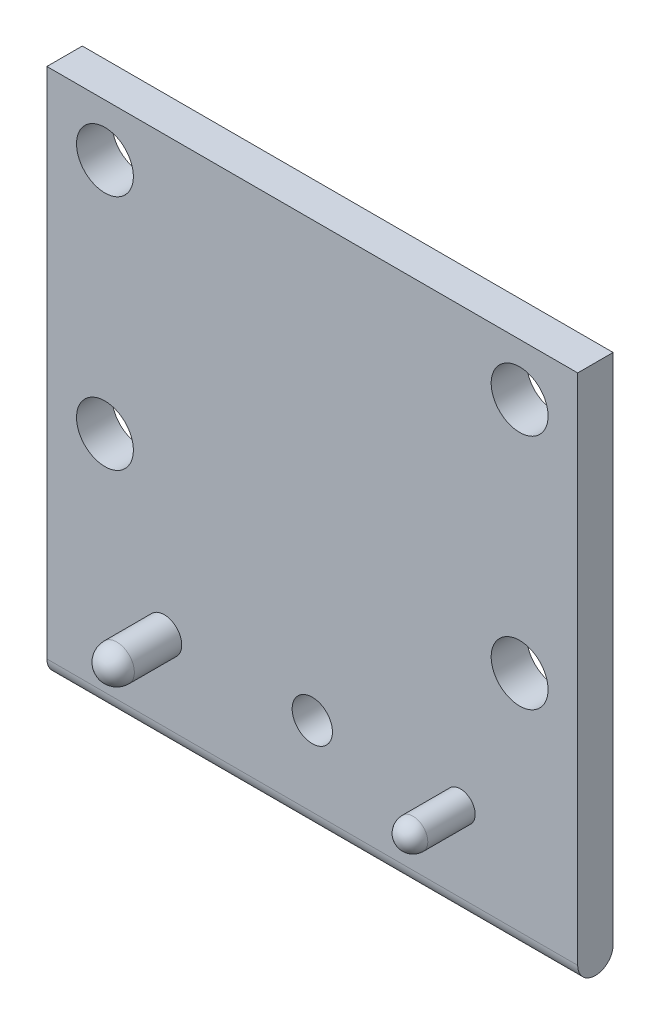
ISO-10303-21;
HEADER;
FILE_DESCRIPTION(('STEP AP214'),'2;1');
FILE_NAME('part.step','',(''),(''),'','','');
FILE_SCHEMA(('AUTOMOTIVE_DESIGN { 1 0 10303 214 1 1 1 1 }'));
ENDSEC;
DATA;
#1=APPLICATION_CONTEXT('core data for automotive mechanical design processes');
#2=APPLICATION_PROTOCOL_DEFINITION('international standard','automotive_design',2000,#1);
#3=PRODUCT_CONTEXT('',#1,'mechanical');
#4=PRODUCT('Part','Part','',(#3));
#5=PRODUCT_RELATED_PRODUCT_CATEGORY('part','',(#4));
#6=PRODUCT_DEFINITION_FORMATION('','',#4);
#7=PRODUCT_DEFINITION_CONTEXT('part definition',#1,'design');
#8=PRODUCT_DEFINITION('design','',#6,#7);
#9=PRODUCT_DEFINITION_SHAPE('','',#8);
#10=(LENGTH_UNIT() NAMED_UNIT(*) SI_UNIT(.MILLI.,.METRE.));
#11=(NAMED_UNIT(*) PLANE_ANGLE_UNIT() SI_UNIT($,.RADIAN.));
#12=(NAMED_UNIT(*) SI_UNIT($,.STERADIAN.) SOLID_ANGLE_UNIT());
#13=UNCERTAINTY_MEASURE_WITH_UNIT(LENGTH_MEASURE(1.E-05),#10,'distance_accuracy_value','');
#14=(GEOMETRIC_REPRESENTATION_CONTEXT(3) GLOBAL_UNCERTAINTY_ASSIGNED_CONTEXT((#13)) GLOBAL_UNIT_ASSIGNED_CONTEXT((#10,
#11,#12)) REPRESENTATION_CONTEXT('',''));
#15=CARTESIAN_POINT('',(0.,0.,0.));
#16=DIRECTION('',(0.,0.,1.));
#17=DIRECTION('',(1.,0.,0.));
#18=AXIS2_PLACEMENT_3D('',#15,#16,#17);
#19=CARTESIAN_POINT('',(-22.4,44.8,1.495));
#20=DIRECTION('',(0.,0.,-1.));
#21=DIRECTION('',(-1.,0.,0.));
#22=AXIS2_PLACEMENT_3D('',#19,#20,#21);
#23=PLANE('',#22);
#24=CARTESIAN_POINT('',(-12.5,8.2,1.495));
#25=DIRECTION('',(0.,0.,-1.));
#26=DIRECTION('',(-1.,0.,0.));
#27=AXIS2_PLACEMENT_3D('',#24,#25,#26);
#28=CIRCLE('',#27,1.4818525370309);
#29=CARTESIAN_POINT('',(-13.9818525370309,8.2,1.495));
#30=VERTEX_POINT('',#29);
#31=EDGE_CURVE('E11',#30,#30,#28,.F.);
#32=ORIENTED_EDGE('',*,*,#31,.F.);
#33=EDGE_LOOP('',(#32));
#34=FACE_BOUND('',#33,.T.);
#35=CARTESIAN_POINT('',(12.5,8.2,1.495));
#36=DIRECTION('',(0.,0.,-1.));
#37=DIRECTION('',(-1.,0.,0.));
#38=AXIS2_PLACEMENT_3D('',#35,#36,#37);
#39=CIRCLE('',#38,1.24964282442419);
#40=CARTESIAN_POINT('',(11.2503571755758,8.2,1.495));
#41=VERTEX_POINT('',#40);
#42=EDGE_CURVE('E57',#41,#41,#39,.F.);
#43=ORIENTED_EDGE('',*,*,#42,.F.);
#44=EDGE_LOOP('',(#43));
#45=FACE_BOUND('',#44,.T.);
#46=CARTESIAN_POINT('',(0.,8.2,1.495));
#47=DIRECTION('',(0.,0.,1.));
#48=DIRECTION('',(1.,0.,0.));
#49=AXIS2_PLACEMENT_3D('',#46,#47,#48);
#50=CIRCLE('',#49,1.7);
#51=CARTESIAN_POINT('',(1.7,8.2,1.495));
#52=VERTEX_POINT('',#51);
#53=EDGE_CURVE('E142',#52,#52,#50,.T.);
#54=ORIENTED_EDGE('',*,*,#53,.F.);
#55=EDGE_LOOP('',(#54));
#56=FACE_BOUND('',#55,.T.);
#57=CARTESIAN_POINT('',(-17.5,40.4,1.495));
#58=DIRECTION('',(0.,0.,1.));
#59=DIRECTION('',(1.,0.,0.));
#60=AXIS2_PLACEMENT_3D('',#57,#58,#59);
#61=CIRCLE('',#60,2.39999999999999);
#62=CARTESIAN_POINT('',(-15.1,40.4,1.495));
#63=VERTEX_POINT('',#62);
#64=EDGE_CURVE('E146',#63,#63,#61,.T.);
#65=ORIENTED_EDGE('',*,*,#64,.F.);
#66=EDGE_LOOP('',(#65));
#67=FACE_BOUND('',#66,.T.);
#68=CARTESIAN_POINT('',(17.5,40.4,1.495));
#69=DIRECTION('',(0.,0.,1.));
#70=DIRECTION('',(1.,0.,0.));
#71=AXIS2_PLACEMENT_3D('',#68,#69,#70);
#72=CIRCLE('',#71,2.39999999999999);
#73=CARTESIAN_POINT('',(19.9,40.4,1.495));
#74=VERTEX_POINT('',#73);
#75=EDGE_CURVE('E150',#74,#74,#72,.T.);
#76=ORIENTED_EDGE('',*,*,#75,.F.);
#77=EDGE_LOOP('',(#76));
#78=FACE_BOUND('',#77,.T.);
#79=DIRECTION('',(0.,-1.,0.));
#80=VECTOR('',#79,1.);
#81=CARTESIAN_POINT('',(-22.4,44.8,1.495));
#82=LINE('',#81,#80);
#83=CARTESIAN_POINT('',(-22.4,44.8,1.495));
#84=VERTEX_POINT('',#83);
#85=CARTESIAN_POINT('',(-22.4,1.495,1.495));
#86=VERTEX_POINT('',#85);
#87=EDGE_CURVE('E120',#84,#86,#82,.T.);
#88=ORIENTED_EDGE('',*,*,#87,.T.);
#89=DIRECTION('',(-1.,0.,0.));
#90=VECTOR('',#89,1.);
#91=CARTESIAN_POINT('',(-22.4,1.495,1.495));
#92=LINE('',#91,#90);
#93=CARTESIAN_POINT('',(22.4,1.495,1.495));
#94=VERTEX_POINT('',#93);
#95=EDGE_CURVE('E113',#86,#94,#92,.F.);
#96=ORIENTED_EDGE('',*,*,#95,.T.);
#97=DIRECTION('',(0.,-1.,0.));
#98=VECTOR('',#97,1.);
#99=CARTESIAN_POINT('',(22.4,44.8,1.495));
#100=LINE('',#99,#98);
#101=CARTESIAN_POINT('',(22.4,44.8,1.495));
#102=VERTEX_POINT('',#101);
#103=EDGE_CURVE('E189',#102,#94,#100,.T.);
#104=ORIENTED_EDGE('',*,*,#103,.F.);
#105=DIRECTION('',(1.,0.,0.));
#106=VECTOR('',#105,1.);
#107=CARTESIAN_POINT('',(-22.4,44.8,1.495));
#108=LINE('',#107,#106);
#109=EDGE_CURVE('E106',#84,#102,#108,.T.);
#110=ORIENTED_EDGE('',*,*,#109,.F.);
#111=EDGE_LOOP('',(#88,#96,#104,#110));
#112=FACE_BOUND('',#111,.T.);
#113=CARTESIAN_POINT('',(17.5,20.4,1.495));
#114=DIRECTION('',(0.,0.,1.));
#115=DIRECTION('',(1.,0.,0.));
#116=AXIS2_PLACEMENT_3D('',#113,#114,#115);
#117=CIRCLE('',#116,2.39999999999999);
#118=CARTESIAN_POINT('',(19.9,20.4,1.495));
#119=VERTEX_POINT('',#118);
#120=EDGE_CURVE('E157',#119,#119,#117,.T.);
#121=ORIENTED_EDGE('',*,*,#120,.F.);
#122=EDGE_LOOP('',(#121));
#123=FACE_BOUND('',#122,.T.);
#124=CARTESIAN_POINT('',(-17.5,20.4,1.495));
#125=DIRECTION('',(0.,0.,1.));
#126=DIRECTION('',(1.,0.,0.));
#127=AXIS2_PLACEMENT_3D('',#124,#125,#126);
#128=CIRCLE('',#127,2.39999999999999);
#129=CARTESIAN_POINT('',(-15.1,20.4,1.495));
#130=VERTEX_POINT('',#129);
#131=EDGE_CURVE('E160',#130,#130,#128,.T.);
#132=ORIENTED_EDGE('',*,*,#131,.F.);
#133=EDGE_LOOP('',(#132));
#134=FACE_BOUND('',#133,.T.);
#135=ADVANCED_FACE('F47',(#34,#45,#56,#67,#78,#112,#123,#134),#23,.F.);
#136=CARTESIAN_POINT('',(-22.4,1.495,0.));
#137=DIRECTION('',(1.,0.,0.));
#138=DIRECTION('',(0.,0.,-1.));
#139=AXIS2_PLACEMENT_3D('',#136,#137,#138);
#140=CYLINDRICAL_SURFACE('',#139,1.495);
#141=ORIENTED_EDGE('',*,*,#95,.F.);
#142=CARTESIAN_POINT('',(-22.4,1.495,0.));
#143=DIRECTION('',(1.,0.,0.));
#144=DIRECTION('',(0.,0.,-1.));
#145=AXIS2_PLACEMENT_3D('',#142,#143,#144);
#146=CIRCLE('',#145,1.495);
#147=CARTESIAN_POINT('',(-22.4,1.495,-1.495));
#148=VERTEX_POINT('',#147);
#149=EDGE_CURVE('E71',#148,#86,#146,.F.);
#150=ORIENTED_EDGE('',*,*,#149,.F.);
#151=DIRECTION('',(-1.,0.,0.));
#152=VECTOR('',#151,1.);
#153=CARTESIAN_POINT('',(-22.4,1.495,-1.495));
#154=LINE('',#153,#152);
#155=CARTESIAN_POINT('',(22.4,1.495,-1.495));
#156=VERTEX_POINT('',#155);
#157=EDGE_CURVE('E118',#156,#148,#154,.T.);
#158=ORIENTED_EDGE('',*,*,#157,.F.);
#159=CARTESIAN_POINT('',(22.4,1.495,0.));
#160=DIRECTION('',(-1.,0.,0.));
#161=DIRECTION('',(0.,0.,1.));
#162=AXIS2_PLACEMENT_3D('',#159,#160,#161);
#163=CIRCLE('',#162,1.495);
#164=EDGE_CURVE('E64',#94,#156,#163,.F.);
#165=ORIENTED_EDGE('',*,*,#164,.F.);
#166=EDGE_LOOP('',(#141,#150,#158,#165));
#167=FACE_BOUND('',#166,.T.);
#168=ADVANCED_FACE('F50',(#167),#140,.T.);
#169=CARTESIAN_POINT('',(22.4,44.8,1.495));
#170=DIRECTION('',(-1.,0.,0.));
#171=DIRECTION('',(0.,0.,1.));
#172=AXIS2_PLACEMENT_3D('',#169,#170,#171);
#173=PLANE('',#172);
#174=ORIENTED_EDGE('',*,*,#103,.T.);
#175=ORIENTED_EDGE('',*,*,#164,.T.);
#176=DIRECTION('',(0.,-1.,0.));
#177=VECTOR('',#176,1.);
#178=CARTESIAN_POINT('',(22.4,44.8,-1.495));
#179=LINE('',#178,#177);
#180=CARTESIAN_POINT('',(22.4,44.8,-1.495));
#181=VERTEX_POINT('',#180);
#182=EDGE_CURVE('E94',#181,#156,#179,.T.);
#183=ORIENTED_EDGE('',*,*,#182,.F.);
#184=DIRECTION('',(0.,0.,-1.));
#185=VECTOR('',#184,1.);
#186=CARTESIAN_POINT('',(22.4,44.8,1.495));
#187=LINE('',#186,#185);
#188=EDGE_CURVE('E101',#102,#181,#187,.T.);
#189=ORIENTED_EDGE('',*,*,#188,.F.);
#190=EDGE_LOOP('',(#174,#175,#183,#189));
#191=FACE_BOUND('',#190,.T.);
#192=ADVANCED_FACE('F111',(#191),#173,.F.);
#193=CARTESIAN_POINT('',(-22.4,44.8,-1.495));
#194=DIRECTION('',(0.,0.,1.));
#195=DIRECTION('',(1.,0.,0.));
#196=AXIS2_PLACEMENT_3D('',#193,#194,#195);
#197=PLANE('',#196);
#198=CARTESIAN_POINT('',(0.,8.2,-1.495));
#199=DIRECTION('',(0.,0.,1.));
#200=DIRECTION('',(1.,0.,0.));
#201=AXIS2_PLACEMENT_3D('',#198,#199,#200);
#202=CIRCLE('',#201,1.7);
#203=CARTESIAN_POINT('',(1.7,8.2,-1.495));
#204=VERTEX_POINT('',#203);
#205=EDGE_CURVE('E337',#204,#204,#202,.T.);
#206=ORIENTED_EDGE('',*,*,#205,.T.);
#207=EDGE_LOOP('',(#206));
#208=FACE_BOUND('',#207,.T.);
#209=CARTESIAN_POINT('',(-17.5,40.4,-1.495));
#210=DIRECTION('',(0.,0.,1.));
#211=DIRECTION('',(1.,0.,0.));
#212=AXIS2_PLACEMENT_3D('',#209,#210,#211);
#213=CIRCLE('',#212,2.39999999999999);
#214=CARTESIAN_POINT('',(-15.1,40.4,-1.495));
#215=VERTEX_POINT('',#214);
#216=EDGE_CURVE('E164',#215,#215,#213,.T.);
#217=ORIENTED_EDGE('',*,*,#216,.T.);
#218=EDGE_LOOP('',(#217));
#219=FACE_BOUND('',#218,.T.);
#220=CARTESIAN_POINT('',(-17.5,20.4,-1.495));
#221=DIRECTION('',(0.,0.,1.));
#222=DIRECTION('',(1.,0.,0.));
#223=AXIS2_PLACEMENT_3D('',#220,#221,#222);
#224=CIRCLE('',#223,2.39999999999999);
#225=CARTESIAN_POINT('',(-15.1,20.4,-1.495));
#226=VERTEX_POINT('',#225);
#227=EDGE_CURVE('E163',#226,#226,#224,.T.);
#228=ORIENTED_EDGE('',*,*,#227,.T.);
#229=EDGE_LOOP('',(#228));
#230=FACE_BOUND('',#229,.T.);
#231=CARTESIAN_POINT('',(17.5,20.4,-1.495));
#232=DIRECTION('',(0.,0.,1.));
#233=DIRECTION('',(1.,0.,0.));
#234=AXIS2_PLACEMENT_3D('',#231,#232,#233);
#235=CIRCLE('',#234,2.39999999999999);
#236=CARTESIAN_POINT('',(19.9,20.4,-1.495));
#237=VERTEX_POINT('',#236);
#238=EDGE_CURVE('E176',#237,#237,#235,.T.);
#239=ORIENTED_EDGE('',*,*,#238,.T.);
#240=EDGE_LOOP('',(#239));
#241=FACE_BOUND('',#240,.T.);
#242=CARTESIAN_POINT('',(17.5,40.4,-1.495));
#243=DIRECTION('',(0.,0.,1.));
#244=DIRECTION('',(1.,0.,0.));
#245=AXIS2_PLACEMENT_3D('',#242,#243,#244);
#246=CIRCLE('',#245,2.39999999999999);
#247=CARTESIAN_POINT('',(19.9,40.4,-1.495));
#248=VERTEX_POINT('',#247);
#249=EDGE_CURVE('E109',#248,#248,#246,.T.);
#250=ORIENTED_EDGE('',*,*,#249,.T.);
#251=EDGE_LOOP('',(#250));
#252=FACE_BOUND('',#251,.T.);
#253=ORIENTED_EDGE('',*,*,#182,.T.);
#254=ORIENTED_EDGE('',*,*,#157,.T.);
#255=DIRECTION('',(0.,-1.,0.));
#256=VECTOR('',#255,1.);
#257=CARTESIAN_POINT('',(-22.4,44.8,-1.495));
#258=LINE('',#257,#256);
#259=CARTESIAN_POINT('',(-22.4,44.8,-1.495));
#260=VERTEX_POINT('',#259);
#261=EDGE_CURVE('E96',#260,#148,#258,.T.);
#262=ORIENTED_EDGE('',*,*,#261,.F.);
#263=DIRECTION('',(-1.,0.,0.));
#264=VECTOR('',#263,1.);
#265=CARTESIAN_POINT('',(-22.4,44.8,-1.495));
#266=LINE('',#265,#264);
#267=EDGE_CURVE('E91',#181,#260,#266,.T.);
#268=ORIENTED_EDGE('',*,*,#267,.F.);
#269=EDGE_LOOP('',(#253,#254,#262,#268));
#270=FACE_BOUND('',#269,.T.);
#271=ADVANCED_FACE('F93',(#208,#219,#230,#241,#252,#270),#197,.F.);
#272=CARTESIAN_POINT('',(-22.4,44.8,1.495));
#273=DIRECTION('',(1.,0.,0.));
#274=DIRECTION('',(0.,0.,-1.));
#275=AXIS2_PLACEMENT_3D('',#272,#273,#274);
#276=PLANE('',#275);
#277=ORIENTED_EDGE('',*,*,#261,.T.);
#278=ORIENTED_EDGE('',*,*,#149,.T.);
#279=ORIENTED_EDGE('',*,*,#87,.F.);
#280=DIRECTION('',(0.,0.,1.));
#281=VECTOR('',#280,1.);
#282=CARTESIAN_POINT('',(-22.4,44.8,1.495));
#283=LINE('',#282,#281);
#284=EDGE_CURVE('E100',#260,#84,#283,.T.);
#285=ORIENTED_EDGE('',*,*,#284,.F.);
#286=EDGE_LOOP('',(#277,#278,#279,#285));
#287=FACE_BOUND('',#286,.T.);
#288=ADVANCED_FACE('F193',(#287),#276,.F.);
#289=CARTESIAN_POINT('',(0.,44.8,0.));
#290=DIRECTION('',(0.,-1.,0.));
#291=DIRECTION('',(0.,0.,-1.));
#292=AXIS2_PLACEMENT_3D('',#289,#290,#291);
#293=PLANE('',#292);
#294=ORIENTED_EDGE('',*,*,#188,.T.);
#295=ORIENTED_EDGE('',*,*,#267,.T.);
#296=ORIENTED_EDGE('',*,*,#284,.T.);
#297=ORIENTED_EDGE('',*,*,#109,.T.);
#298=EDGE_LOOP('',(#294,#295,#296,#297));
#299=FACE_BOUND('',#298,.T.);
#300=ADVANCED_FACE('F104',(#299),#293,.F.);
#301=CARTESIAN_POINT('',(17.5,40.4,1.495));
#302=DIRECTION('',(0.,0.,1.));
#303=DIRECTION('',(1.,0.,0.));
#304=AXIS2_PLACEMENT_3D('',#301,#302,#303);
#305=CYLINDRICAL_SURFACE('',#304,2.39999999999999);
#306=ORIENTED_EDGE('',*,*,#249,.F.);
#307=EDGE_LOOP('',(#306));
#308=FACE_BOUND('',#307,.T.);
#309=ORIENTED_EDGE('',*,*,#75,.T.);
#310=EDGE_LOOP('',(#309));
#311=FACE_BOUND('',#310,.T.);
#312=ADVANCED_FACE('F201',(#308,#311),#305,.F.);
#313=CARTESIAN_POINT('',(17.5,20.4,1.495));
#314=DIRECTION('',(0.,0.,1.));
#315=DIRECTION('',(1.,0.,0.));
#316=AXIS2_PLACEMENT_3D('',#313,#314,#315);
#317=CYLINDRICAL_SURFACE('',#316,2.39999999999999);
#318=ORIENTED_EDGE('',*,*,#238,.F.);
#319=EDGE_LOOP('',(#318));
#320=FACE_BOUND('',#319,.T.);
#321=ORIENTED_EDGE('',*,*,#120,.T.);
#322=EDGE_LOOP('',(#321));
#323=FACE_BOUND('',#322,.T.);
#324=ADVANCED_FACE('F304',(#320,#323),#317,.F.);
#325=CARTESIAN_POINT('',(-17.5,20.4,1.495));
#326=DIRECTION('',(0.,0.,1.));
#327=DIRECTION('',(1.,0.,0.));
#328=AXIS2_PLACEMENT_3D('',#325,#326,#327);
#329=CYLINDRICAL_SURFACE('',#328,2.39999999999999);
#330=ORIENTED_EDGE('',*,*,#227,.F.);
#331=EDGE_LOOP('',(#330));
#332=FACE_BOUND('',#331,.T.);
#333=ORIENTED_EDGE('',*,*,#131,.T.);
#334=EDGE_LOOP('',(#333));
#335=FACE_BOUND('',#334,.T.);
#336=ADVANCED_FACE('F296',(#332,#335),#329,.F.);
#337=CARTESIAN_POINT('',(-17.5,40.4,1.495));
#338=DIRECTION('',(0.,0.,1.));
#339=DIRECTION('',(1.,0.,0.));
#340=AXIS2_PLACEMENT_3D('',#337,#338,#339);
#341=CYLINDRICAL_SURFACE('',#340,2.39999999999999);
#342=ORIENTED_EDGE('',*,*,#216,.F.);
#343=EDGE_LOOP('',(#342));
#344=FACE_BOUND('',#343,.T.);
#345=ORIENTED_EDGE('',*,*,#64,.T.);
#346=EDGE_LOOP('',(#345));
#347=FACE_BOUND('',#346,.T.);
#348=ADVANCED_FACE('F237',(#344,#347),#341,.F.);
#349=CARTESIAN_POINT('',(0.,8.2,1.495));
#350=DIRECTION('',(0.,0.,1.));
#351=DIRECTION('',(1.,0.,0.));
#352=AXIS2_PLACEMENT_3D('',#349,#350,#351);
#353=CYLINDRICAL_SURFACE('',#352,1.7);
#354=ORIENTED_EDGE('',*,*,#205,.F.);
#355=EDGE_LOOP('',(#354));
#356=FACE_BOUND('',#355,.T.);
#357=ORIENTED_EDGE('',*,*,#53,.T.);
#358=EDGE_LOOP('',(#357));
#359=FACE_BOUND('',#358,.T.);
#360=ADVANCED_FACE('F241',(#356,#359),#353,.F.);
#361=CARTESIAN_POINT('',(12.5,8.2,5.495));
#362=DIRECTION('',(0.,0.,-1.));
#363=DIRECTION('',(-1.,0.,0.));
#364=AXIS2_PLACEMENT_3D('',#361,#362,#363);
#365=CYLINDRICAL_SURFACE('',#364,1.24964282442419);
#366=CARTESIAN_POINT('',(12.5,8.2,5.495));
#367=DIRECTION('',(0.,0.,1.));
#368=DIRECTION('',(1.,0.,0.));
#369=AXIS2_PLACEMENT_3D('',#366,#367,#368);
#370=CIRCLE('',#369,1.24964282442419);
#371=CARTESIAN_POINT('',(13.7496428244242,8.2,5.495));
#372=VERTEX_POINT('',#371);
#373=EDGE_CURVE('E345',#372,#372,#370,.T.);
#374=ORIENTED_EDGE('',*,*,#373,.F.);
#375=EDGE_LOOP('',(#374));
#376=FACE_BOUND('',#375,.T.);
#377=ORIENTED_EDGE('',*,*,#42,.T.);
#378=EDGE_LOOP('',(#377));
#379=FACE_BOUND('',#378,.T.);
#380=ADVANCED_FACE('F133',(#376,#379),#365,.T.);
#381=CARTESIAN_POINT('',(-12.5,8.2,5.495));
#382=DIRECTION('',(0.,0.,-1.));
#383=DIRECTION('',(-1.,0.,0.));
#384=AXIS2_PLACEMENT_3D('',#381,#382,#383);
#385=CYLINDRICAL_SURFACE('',#384,1.4818525370309);
#386=CARTESIAN_POINT('',(-12.5,8.2,5.495));
#387=DIRECTION('',(0.,0.,1.));
#388=DIRECTION('',(1.,0.,0.));
#389=AXIS2_PLACEMENT_3D('',#386,#387,#388);
#390=CIRCLE('',#389,1.4818525370309);
#391=CARTESIAN_POINT('',(-11.0181474629691,8.2,5.495));
#392=VERTEX_POINT('',#391);
#393=EDGE_CURVE('E344',#392,#392,#390,.T.);
#394=ORIENTED_EDGE('',*,*,#393,.F.);
#395=EDGE_LOOP('',(#394));
#396=FACE_BOUND('',#395,.T.);
#397=ORIENTED_EDGE('',*,*,#31,.T.);
#398=EDGE_LOOP('',(#397));
#399=FACE_BOUND('',#398,.T.);
#400=ADVANCED_FACE('F257',(#396,#399),#385,.T.);
#401=CARTESIAN_POINT('',(-12.5,8.2,5.495));
#402=DIRECTION('',(0.,1.,0.));
#403=DIRECTION('',(-1.,0.,0.));
#404=AXIS2_PLACEMENT_3D('',#401,#402,#403);
#405=SPHERICAL_SURFACE('',#404,1.4818525370309);
#406=CARTESIAN_POINT('',(-12.5,8.2,5.495));
#407=DIRECTION('',(0.,0.,1.));
#408=DIRECTION('',(1.,0.,0.));
#409=AXIS2_PLACEMENT_3D('',#406,#407,#408);
#410=SPHERICAL_SURFACE('',#409,1.4818525370309);
#411=ORIENTED_EDGE('',*,*,#393,.T.);
#412=EDGE_LOOP('',(#411));
#413=FACE_BOUND('',#412,.T.);
#414=ADVANCED_FACE('F266',(#413),#410,.T.);
#415=CARTESIAN_POINT('',(12.5,8.2,5.495));
#416=DIRECTION('',(0.,1.,0.));
#417=DIRECTION('',(-1.,0.,0.));
#418=AXIS2_PLACEMENT_3D('',#415,#416,#417);
#419=SPHERICAL_SURFACE('',#418,1.24964282442419);
#420=CARTESIAN_POINT('',(12.5,8.2,5.495));
#421=DIRECTION('',(0.,0.,1.));
#422=DIRECTION('',(1.,0.,0.));
#423=AXIS2_PLACEMENT_3D('',#420,#421,#422);
#424=SPHERICAL_SURFACE('',#423,1.24964282442419);
#425=ORIENTED_EDGE('',*,*,#373,.T.);
#426=EDGE_LOOP('',(#425));
#427=FACE_BOUND('',#426,.T.);
#428=ADVANCED_FACE('F275',(#427),#424,.T.);
#429=CLOSED_SHELL('',(#135,#168,#192,#271,#288,#300,#312,#324,#336,#348,#360,#380,#400,#414,#428));
#430=MANIFOLD_SOLID_BREP('B2',#429);
#431=ADVANCED_BREP_SHAPE_REPRESENTATION('',(#18,#430),#14);
#432=SHAPE_DEFINITION_REPRESENTATION(#9,#431);
ENDSEC;
END-ISO-10303-21;
